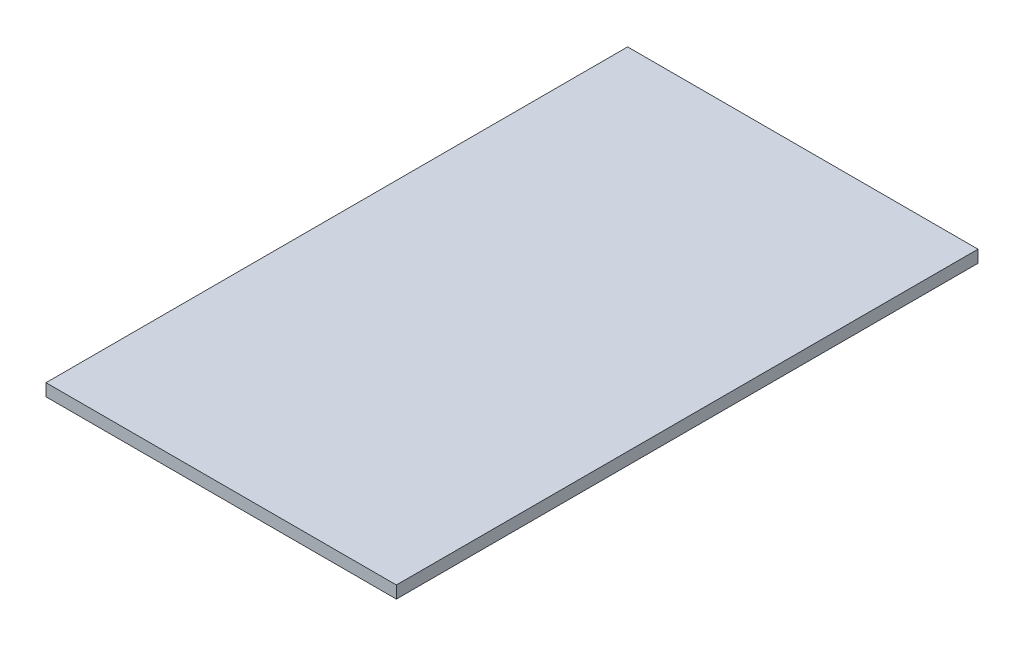
ISO-10303-21;
HEADER;
FILE_DESCRIPTION(('STEP AP214'),'2;1');
FILE_NAME('part.step','',(''),(''),'','','');
FILE_SCHEMA(('AUTOMOTIVE_DESIGN { 1 0 10303 214 1 1 1 1 }'));
ENDSEC;
DATA;
#1=APPLICATION_CONTEXT('core data for automotive mechanical design processes');
#2=APPLICATION_PROTOCOL_DEFINITION('international standard','automotive_design',2000,#1);
#3=PRODUCT_CONTEXT('',#1,'mechanical');
#4=PRODUCT('Part','Part','',(#3));
#5=PRODUCT_RELATED_PRODUCT_CATEGORY('part','',(#4));
#6=PRODUCT_DEFINITION_FORMATION('','',#4);
#7=PRODUCT_DEFINITION_CONTEXT('part definition',#1,'design');
#8=PRODUCT_DEFINITION('design','',#6,#7);
#9=PRODUCT_DEFINITION_SHAPE('','',#8);
#10=(LENGTH_UNIT() NAMED_UNIT(*) SI_UNIT(.MILLI.,.METRE.));
#11=(NAMED_UNIT(*) PLANE_ANGLE_UNIT() SI_UNIT($,.RADIAN.));
#12=(NAMED_UNIT(*) SI_UNIT($,.STERADIAN.) SOLID_ANGLE_UNIT());
#13=UNCERTAINTY_MEASURE_WITH_UNIT(LENGTH_MEASURE(1.E-05),#10,'distance_accuracy_value','');
#14=(GEOMETRIC_REPRESENTATION_CONTEXT(3) GLOBAL_UNCERTAINTY_ASSIGNED_CONTEXT((#13)) GLOBAL_UNIT_ASSIGNED_CONTEXT((#10,
#11,#12)) REPRESENTATION_CONTEXT('',''));
#15=CARTESIAN_POINT('',(0.,0.,0.));
#16=DIRECTION('',(0.,0.,1.));
#17=DIRECTION('',(1.,0.,0.));
#18=AXIS2_PLACEMENT_3D('',#15,#16,#17);
#19=CARTESIAN_POINT('',(50.,3.5,83.));
#20=DIRECTION('',(-1.,0.,0.));
#21=DIRECTION('',(0.,0.,1.));
#22=AXIS2_PLACEMENT_3D('',#19,#20,#21);
#23=PLANE('',#22);
#24=DIRECTION('',(0.,0.,-1.));
#25=VECTOR('',#24,1.);
#26=CARTESIAN_POINT('',(50.,0.,83.));
#27=LINE('',#26,#25);
#28=CARTESIAN_POINT('',(50.,0.,83.));
#29=VERTEX_POINT('',#28);
#30=CARTESIAN_POINT('',(50.,0.,-83.));
#31=VERTEX_POINT('',#30);
#32=EDGE_CURVE('E128',#29,#31,#27,.T.);
#33=ORIENTED_EDGE('',*,*,#32,.T.);
#34=DIRECTION('',(0.,-1.,0.));
#35=VECTOR('',#34,1.);
#36=CARTESIAN_POINT('',(50.,3.5,-83.));
#37=LINE('',#36,#35);
#38=CARTESIAN_POINT('',(50.,3.5,-83.));
#39=VERTEX_POINT('',#38);
#40=EDGE_CURVE('E11',#39,#31,#37,.T.);
#41=ORIENTED_EDGE('',*,*,#40,.F.);
#42=DIRECTION('',(0.,0.,-1.));
#43=VECTOR('',#42,1.);
#44=CARTESIAN_POINT('',(50.,3.5,83.));
#45=LINE('',#44,#43);
#46=CARTESIAN_POINT('',(50.,3.5,83.));
#47=VERTEX_POINT('',#46);
#48=EDGE_CURVE('E138',#47,#39,#45,.T.);
#49=ORIENTED_EDGE('',*,*,#48,.F.);
#50=DIRECTION('',(0.,-1.,0.));
#51=VECTOR('',#50,1.);
#52=CARTESIAN_POINT('',(50.,3.5,83.));
#53=LINE('',#52,#51);
#54=EDGE_CURVE('E151',#47,#29,#53,.T.);
#55=ORIENTED_EDGE('',*,*,#54,.T.);
#56=EDGE_LOOP('',(#33,#41,#49,#55));
#57=FACE_BOUND('',#56,.T.);
#58=ADVANCED_FACE('F39',(#57),#23,.F.);
#59=CARTESIAN_POINT('',(-50.,3.5,-83.));
#60=DIRECTION('',(0.,0.,1.));
#61=DIRECTION('',(1.,0.,0.));
#62=AXIS2_PLACEMENT_3D('',#59,#60,#61);
#63=PLANE('',#62);
#64=DIRECTION('',(-1.,0.,0.));
#65=VECTOR('',#64,1.);
#66=CARTESIAN_POINT('',(-50.,0.,-83.));
#67=LINE('',#66,#65);
#68=CARTESIAN_POINT('',(26.,0.,-83.));
#69=VERTEX_POINT('',#68);
#70=EDGE_CURVE('E153',#31,#69,#67,.T.);
#71=ORIENTED_EDGE('',*,*,#70,.T.);
#72=DIRECTION('',(0.,1.,0.));
#73=VECTOR('',#72,1.);
#74=CARTESIAN_POINT('',(26.,-5.,-83.));
#75=LINE('',#74,#73);
#76=CARTESIAN_POINT('',(26.,-5.,-83.));
#77=VERTEX_POINT('',#76);
#78=EDGE_CURVE('E109',#77,#69,#75,.T.);
#79=ORIENTED_EDGE('',*,*,#78,.F.);
#80=DIRECTION('',(1.,0.,0.));
#81=VECTOR('',#80,1.);
#82=CARTESIAN_POINT('',(-46.,-5.,-83.));
#83=LINE('',#82,#81);
#84=CARTESIAN_POINT('',(-46.,-5.,-83.));
#85=VERTEX_POINT('',#84);
#86=EDGE_CURVE('E102',#85,#77,#83,.T.);
#87=ORIENTED_EDGE('',*,*,#86,.F.);
#88=DIRECTION('',(0.,1.,0.));
#89=VECTOR('',#88,1.);
#90=CARTESIAN_POINT('',(-46.,-5.,-83.));
#91=LINE('',#90,#89);
#92=CARTESIAN_POINT('',(-46.,0.,-83.));
#93=VERTEX_POINT('',#92);
#94=EDGE_CURVE('E107',#85,#93,#91,.T.);
#95=ORIENTED_EDGE('',*,*,#94,.T.);
#96=CARTESIAN_POINT('',(-50.,0.,-83.));
#97=VERTEX_POINT('',#96);
#98=EDGE_CURVE('E59',#93,#97,#67,.T.);
#99=ORIENTED_EDGE('',*,*,#98,.T.);
#100=DIRECTION('',(0.,-1.,0.));
#101=VECTOR('',#100,1.);
#102=CARTESIAN_POINT('',(-50.,3.5,-83.));
#103=LINE('',#102,#101);
#104=CARTESIAN_POINT('',(-50.,3.5,-83.));
#105=VERTEX_POINT('',#104);
#106=EDGE_CURVE('E47',#105,#97,#103,.T.);
#107=ORIENTED_EDGE('',*,*,#106,.F.);
#108=DIRECTION('',(-1.,0.,0.));
#109=VECTOR('',#108,1.);
#110=CARTESIAN_POINT('',(-50.,3.5,-83.));
#111=LINE('',#110,#109);
#112=EDGE_CURVE('E142',#39,#105,#111,.T.);
#113=ORIENTED_EDGE('',*,*,#112,.F.);
#114=ORIENTED_EDGE('',*,*,#40,.T.);
#115=EDGE_LOOP('',(#71,#79,#87,#95,#99,#107,#113,#114));
#116=FACE_BOUND('',#115,.T.);
#117=ADVANCED_FACE('F105',(#116),#63,.F.);
#118=CARTESIAN_POINT('',(-50.,3.5,83.));
#119=DIRECTION('',(1.,0.,0.));
#120=DIRECTION('',(0.,0.,-1.));
#121=AXIS2_PLACEMENT_3D('',#118,#119,#120);
#122=PLANE('',#121);
#123=DIRECTION('',(0.,0.,1.));
#124=VECTOR('',#123,1.);
#125=CARTESIAN_POINT('',(-50.,0.,83.));
#126=LINE('',#125,#124);
#127=CARTESIAN_POINT('',(-50.,0.,83.));
#128=VERTEX_POINT('',#127);
#129=EDGE_CURVE('E156',#97,#128,#126,.T.);
#130=ORIENTED_EDGE('',*,*,#129,.T.);
#131=DIRECTION('',(0.,-1.,0.));
#132=VECTOR('',#131,1.);
#133=CARTESIAN_POINT('',(-50.,3.5,83.));
#134=LINE('',#133,#132);
#135=CARTESIAN_POINT('',(-50.,3.5,83.));
#136=VERTEX_POINT('',#135);
#137=EDGE_CURVE('E164',#136,#128,#134,.T.);
#138=ORIENTED_EDGE('',*,*,#137,.F.);
#139=DIRECTION('',(0.,0.,1.));
#140=VECTOR('',#139,1.);
#141=CARTESIAN_POINT('',(-50.,3.5,83.));
#142=LINE('',#141,#140);
#143=EDGE_CURVE('E146',#105,#136,#142,.T.);
#144=ORIENTED_EDGE('',*,*,#143,.F.);
#145=ORIENTED_EDGE('',*,*,#106,.T.);
#146=EDGE_LOOP('',(#130,#138,#144,#145));
#147=FACE_BOUND('',#146,.T.);
#148=ADVANCED_FACE('F172',(#147),#122,.F.);
#149=CARTESIAN_POINT('',(-50.,3.5,83.));
#150=DIRECTION('',(0.,0.,-1.));
#151=DIRECTION('',(-1.,0.,0.));
#152=AXIS2_PLACEMENT_3D('',#149,#150,#151);
#153=PLANE('',#152);
#154=DIRECTION('',(1.,0.,0.));
#155=VECTOR('',#154,1.);
#156=CARTESIAN_POINT('',(-50.,0.,83.));
#157=LINE('',#156,#155);
#158=EDGE_CURVE('E143',#128,#29,#157,.T.);
#159=ORIENTED_EDGE('',*,*,#158,.T.);
#160=ORIENTED_EDGE('',*,*,#54,.F.);
#161=DIRECTION('',(1.,0.,0.));
#162=VECTOR('',#161,1.);
#163=CARTESIAN_POINT('',(-50.,3.5,83.));
#164=LINE('',#163,#162);
#165=EDGE_CURVE('E149',#136,#47,#164,.T.);
#166=ORIENTED_EDGE('',*,*,#165,.F.);
#167=ORIENTED_EDGE('',*,*,#137,.T.);
#168=EDGE_LOOP('',(#159,#160,#166,#167));
#169=FACE_BOUND('',#168,.T.);
#170=ADVANCED_FACE('F179',(#169),#153,.F.);
#171=CARTESIAN_POINT('',(0.,3.5,0.));
#172=DIRECTION('',(0.,-1.,0.));
#173=DIRECTION('',(0.,0.,-1.));
#174=AXIS2_PLACEMENT_3D('',#171,#172,#173);
#175=PLANE('',#174);
#176=ORIENTED_EDGE('',*,*,#48,.T.);
#177=ORIENTED_EDGE('',*,*,#112,.T.);
#178=ORIENTED_EDGE('',*,*,#143,.T.);
#179=ORIENTED_EDGE('',*,*,#165,.T.);
#180=EDGE_LOOP('',(#176,#177,#178,#179));
#181=FACE_BOUND('',#180,.T.);
#182=ADVANCED_FACE('F185',(#181),#175,.F.);
#183=CARTESIAN_POINT('',(0.,0.,0.));
#184=DIRECTION('',(0.,-1.,0.));
#185=DIRECTION('',(0.,0.,-1.));
#186=AXIS2_PLACEMENT_3D('',#183,#184,#185);
#187=PLANE('',#186);
#188=DIRECTION('',(0.,0.,-1.));
#189=VECTOR('',#188,1.);
#190=CARTESIAN_POINT('',(-46.,0.,-83.));
#191=LINE('',#190,#189);
#192=CARTESIAN_POINT('',(-46.,0.,-43.));
#193=VERTEX_POINT('',#192);
#194=EDGE_CURVE('E54',#193,#93,#191,.T.);
#195=ORIENTED_EDGE('',*,*,#194,.F.);
#196=DIRECTION('',(-1.,0.,0.));
#197=VECTOR('',#196,1.);
#198=CARTESIAN_POINT('',(-46.,0.,-43.));
#199=LINE('',#198,#197);
#200=CARTESIAN_POINT('',(26.,0.,-43.));
#201=VERTEX_POINT('',#200);
#202=EDGE_CURVE('E124',#201,#193,#199,.T.);
#203=ORIENTED_EDGE('',*,*,#202,.F.);
#204=DIRECTION('',(0.,0.,1.));
#205=VECTOR('',#204,1.);
#206=CARTESIAN_POINT('',(26.,0.,-83.));
#207=LINE('',#206,#205);
#208=EDGE_CURVE('E190',#69,#201,#207,.T.);
#209=ORIENTED_EDGE('',*,*,#208,.F.);
#210=ORIENTED_EDGE('',*,*,#70,.F.);
#211=ORIENTED_EDGE('',*,*,#32,.F.);
#212=ORIENTED_EDGE('',*,*,#158,.F.);
#213=ORIENTED_EDGE('',*,*,#129,.F.);
#214=ORIENTED_EDGE('',*,*,#98,.F.);
#215=EDGE_LOOP('',(#195,#203,#209,#210,#211,#212,#213,#214));
#216=FACE_BOUND('',#215,.T.);
#217=ADVANCED_FACE('F175',(#216),#187,.T.);
#218=CARTESIAN_POINT('',(-46.,-5.,-83.));
#219=DIRECTION('',(1.,0.,0.));
#220=DIRECTION('',(0.,0.,-1.));
#221=AXIS2_PLACEMENT_3D('',#218,#219,#220);
#222=PLANE('',#221);
#223=ORIENTED_EDGE('',*,*,#194,.T.);
#224=ORIENTED_EDGE('',*,*,#94,.F.);
#225=DIRECTION('',(0.,0.,-1.));
#226=VECTOR('',#225,1.);
#227=CARTESIAN_POINT('',(-46.,-5.,-83.));
#228=LINE('',#227,#226);
#229=CARTESIAN_POINT('',(-46.,-5.,-43.));
#230=VERTEX_POINT('',#229);
#231=EDGE_CURVE('E114',#230,#85,#228,.T.);
#232=ORIENTED_EDGE('',*,*,#231,.F.);
#233=DIRECTION('',(0.,1.,0.));
#234=VECTOR('',#233,1.);
#235=CARTESIAN_POINT('',(-46.,-5.,-43.));
#236=LINE('',#235,#234);
#237=EDGE_CURVE('E195',#230,#193,#236,.T.);
#238=ORIENTED_EDGE('',*,*,#237,.T.);
#239=EDGE_LOOP('',(#223,#224,#232,#238));
#240=FACE_BOUND('',#239,.T.);
#241=ADVANCED_FACE('F126',(#240),#222,.F.);
#242=CARTESIAN_POINT('',(26.,-5.,-83.));
#243=DIRECTION('',(-1.,0.,0.));
#244=DIRECTION('',(0.,0.,1.));
#245=AXIS2_PLACEMENT_3D('',#242,#243,#244);
#246=PLANE('',#245);
#247=ORIENTED_EDGE('',*,*,#208,.T.);
#248=DIRECTION('',(0.,1.,0.));
#249=VECTOR('',#248,1.);
#250=CARTESIAN_POINT('',(26.,-5.,-43.));
#251=LINE('',#250,#249);
#252=CARTESIAN_POINT('',(26.,-5.,-43.));
#253=VERTEX_POINT('',#252);
#254=EDGE_CURVE('E134',#253,#201,#251,.T.);
#255=ORIENTED_EDGE('',*,*,#254,.F.);
#256=DIRECTION('',(0.,0.,1.));
#257=VECTOR('',#256,1.);
#258=CARTESIAN_POINT('',(26.,-5.,-83.));
#259=LINE('',#258,#257);
#260=EDGE_CURVE('E113',#77,#253,#259,.T.);
#261=ORIENTED_EDGE('',*,*,#260,.F.);
#262=ORIENTED_EDGE('',*,*,#78,.T.);
#263=EDGE_LOOP('',(#247,#255,#261,#262));
#264=FACE_BOUND('',#263,.T.);
#265=ADVANCED_FACE('F188',(#264),#246,.F.);
#266=CARTESIAN_POINT('',(-46.,-5.,-43.));
#267=DIRECTION('',(0.,0.,-1.));
#268=DIRECTION('',(-1.,0.,0.));
#269=AXIS2_PLACEMENT_3D('',#266,#267,#268);
#270=PLANE('',#269);
#271=ORIENTED_EDGE('',*,*,#202,.T.);
#272=ORIENTED_EDGE('',*,*,#237,.F.);
#273=DIRECTION('',(-1.,0.,0.));
#274=VECTOR('',#273,1.);
#275=CARTESIAN_POINT('',(-46.,-5.,-43.));
#276=LINE('',#275,#274);
#277=EDGE_CURVE('E119',#253,#230,#276,.T.);
#278=ORIENTED_EDGE('',*,*,#277,.F.);
#279=ORIENTED_EDGE('',*,*,#254,.T.);
#280=EDGE_LOOP('',(#271,#272,#278,#279));
#281=FACE_BOUND('',#280,.T.);
#282=ADVANCED_FACE('F207',(#281),#270,.F.);
#283=CARTESIAN_POINT('',(0.,-5.,0.));
#284=DIRECTION('',(0.,1.,0.));
#285=DIRECTION('',(0.,0.,1.));
#286=AXIS2_PLACEMENT_3D('',#283,#284,#285);
#287=PLANE('',#286);
#288=ORIENTED_EDGE('',*,*,#231,.T.);
#289=ORIENTED_EDGE('',*,*,#86,.T.);
#290=ORIENTED_EDGE('',*,*,#260,.T.);
#291=ORIENTED_EDGE('',*,*,#277,.T.);
#292=EDGE_LOOP('',(#288,#289,#290,#291));
#293=FACE_BOUND('',#292,.T.);
#294=ADVANCED_FACE('F117',(#293),#287,.F.);
#295=CLOSED_SHELL('',(#58,#117,#148,#170,#182,#217,#241,#265,#282,#294));
#296=MANIFOLD_SOLID_BREP('B2',#295);
#297=ADVANCED_BREP_SHAPE_REPRESENTATION('',(#18,#296),#14);
#298=SHAPE_DEFINITION_REPRESENTATION(#9,#297);
ENDSEC;
END-ISO-10303-21;
